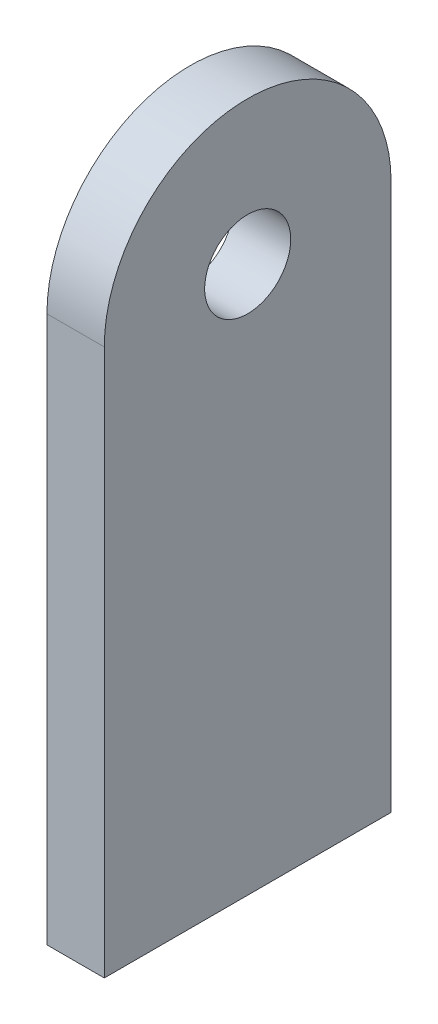
ISO-10303-21;
HEADER;
FILE_DESCRIPTION(('STEP AP214'),'2;1');
FILE_NAME('part.step','',(''),(''),'','','');
FILE_SCHEMA(('AUTOMOTIVE_DESIGN { 1 0 10303 214 1 1 1 1 }'));
ENDSEC;
DATA;
#1=APPLICATION_CONTEXT('core data for automotive mechanical design processes');
#2=APPLICATION_PROTOCOL_DEFINITION('international standard','automotive_design',2000,#1);
#3=PRODUCT_CONTEXT('',#1,'mechanical');
#4=PRODUCT('Part','Part','',(#3));
#5=PRODUCT_RELATED_PRODUCT_CATEGORY('part','',(#4));
#6=PRODUCT_DEFINITION_FORMATION('','',#4);
#7=PRODUCT_DEFINITION_CONTEXT('part definition',#1,'design');
#8=PRODUCT_DEFINITION('design','',#6,#7);
#9=PRODUCT_DEFINITION_SHAPE('','',#8);
#10=(LENGTH_UNIT() NAMED_UNIT(*) SI_UNIT(.MILLI.,.METRE.));
#11=(NAMED_UNIT(*) PLANE_ANGLE_UNIT() SI_UNIT($,.RADIAN.));
#12=(NAMED_UNIT(*) SI_UNIT($,.STERADIAN.) SOLID_ANGLE_UNIT());
#13=UNCERTAINTY_MEASURE_WITH_UNIT(LENGTH_MEASURE(1.E-05),#10,'distance_accuracy_value','');
#14=(GEOMETRIC_REPRESENTATION_CONTEXT(3) GLOBAL_UNCERTAINTY_ASSIGNED_CONTEXT((#13)) GLOBAL_UNIT_ASSIGNED_CONTEXT((#10,
#11,#12)) REPRESENTATION_CONTEXT('',''));
#15=CARTESIAN_POINT('',(0.,0.,0.));
#16=DIRECTION('',(0.,0.,1.));
#17=DIRECTION('',(1.,0.,0.));
#18=AXIS2_PLACEMENT_3D('',#15,#16,#17);
#19=CARTESIAN_POINT('',(10.,50.5673978793407,0.));
#20=DIRECTION('',(1.,0.,0.));
#21=DIRECTION('',(0.,0.,-1.));
#22=AXIS2_PLACEMENT_3D('',#19,#20,#21);
#23=PLANE('',#22);
#24=CARTESIAN_POINT('',(10.,50.5673978793407,0.));
#25=DIRECTION('',(1.,0.,0.));
#26=DIRECTION('',(0.,0.,-1.));
#27=AXIS2_PLACEMENT_3D('',#24,#25,#26);
#28=CIRCLE('',#27,25.);
#29=CARTESIAN_POINT('',(10.,50.5673978793407,-25.));
#30=VERTEX_POINT('',#29);
#31=CARTESIAN_POINT('',(10.,50.5673978793407,25.));
#32=VERTEX_POINT('',#31);
#33=EDGE_CURVE('E84',#30,#32,#28,.T.);
#34=ORIENTED_EDGE('',*,*,#33,.T.);
#35=DIRECTION('',(0.,-1.,0.));
#36=VECTOR('',#35,1.);
#37=CARTESIAN_POINT('',(10.,50.5673978793407,25.));
#38=LINE('',#37,#36);
#39=CARTESIAN_POINT('',(10.,-44.7227033206593,25.));
#40=VERTEX_POINT('',#39);
#41=EDGE_CURVE('E79',#32,#40,#38,.T.);
#42=ORIENTED_EDGE('',*,*,#41,.T.);
#43=DIRECTION('',(0.,0.,-1.));
#44=VECTOR('',#43,1.);
#45=CARTESIAN_POINT('',(10.,-44.7227033206593,25.));
#46=LINE('',#45,#44);
#47=CARTESIAN_POINT('',(10.,-44.7227033206593,-25.));
#48=VERTEX_POINT('',#47);
#49=EDGE_CURVE('E82',#40,#48,#46,.T.);
#50=ORIENTED_EDGE('',*,*,#49,.T.);
#51=DIRECTION('',(0.,1.,0.));
#52=VECTOR('',#51,1.);
#53=CARTESIAN_POINT('',(10.,50.5673978793407,-25.));
#54=LINE('',#53,#52);
#55=EDGE_CURVE('E49',#48,#30,#54,.T.);
#56=ORIENTED_EDGE('',*,*,#55,.T.);
#57=EDGE_LOOP('',(#34,#42,#50,#56));
#58=FACE_BOUND('',#57,.T.);
#59=CARTESIAN_POINT('',(10.,50.5673978793407,0.));
#60=DIRECTION('',(1.,0.,0.));
#61=DIRECTION('',(0.,0.,-1.));
#62=AXIS2_PLACEMENT_3D('',#59,#60,#61);
#63=CIRCLE('',#62,7.5);
#64=CARTESIAN_POINT('',(10.,50.5673978793407,-7.5));
#65=VERTEX_POINT('',#64);
#66=EDGE_CURVE('E99',#65,#65,#63,.T.);
#67=ORIENTED_EDGE('',*,*,#66,.F.);
#68=EDGE_LOOP('',(#67));
#69=FACE_BOUND('',#68,.T.);
#70=ADVANCED_FACE('F32',(#58,#69),#23,.T.);
#71=CARTESIAN_POINT('',(0.,50.5673978793407,0.));
#72=DIRECTION('',(1.,0.,0.));
#73=DIRECTION('',(0.,0.,-1.));
#74=AXIS2_PLACEMENT_3D('',#71,#72,#73);
#75=PLANE('',#74);
#76=CARTESIAN_POINT('',(0.,50.5673978793407,0.));
#77=DIRECTION('',(1.,0.,0.));
#78=DIRECTION('',(0.,0.,-1.));
#79=AXIS2_PLACEMENT_3D('',#76,#77,#78);
#80=CIRCLE('',#79,25.);
#81=CARTESIAN_POINT('',(0.,50.5673978793407,-25.));
#82=VERTEX_POINT('',#81);
#83=CARTESIAN_POINT('',(0.,50.5673978793407,25.));
#84=VERTEX_POINT('',#83);
#85=EDGE_CURVE('E96',#82,#84,#80,.T.);
#86=ORIENTED_EDGE('',*,*,#85,.F.);
#87=DIRECTION('',(0.,1.,0.));
#88=VECTOR('',#87,1.);
#89=CARTESIAN_POINT('',(0.,50.5673978793407,-25.));
#90=LINE('',#89,#88);
#91=CARTESIAN_POINT('',(0.,-44.7227033206593,-25.));
#92=VERTEX_POINT('',#91);
#93=EDGE_CURVE('E72',#92,#82,#90,.T.);
#94=ORIENTED_EDGE('',*,*,#93,.F.);
#95=DIRECTION('',(0.,0.,-1.));
#96=VECTOR('',#95,1.);
#97=CARTESIAN_POINT('',(0.,-44.7227033206593,25.));
#98=LINE('',#97,#96);
#99=CARTESIAN_POINT('',(0.,-44.7227033206593,25.));
#100=VERTEX_POINT('',#99);
#101=EDGE_CURVE('E66',#100,#92,#98,.T.);
#102=ORIENTED_EDGE('',*,*,#101,.F.);
#103=DIRECTION('',(0.,-1.,0.));
#104=VECTOR('',#103,1.);
#105=CARTESIAN_POINT('',(0.,50.5673978793407,25.));
#106=LINE('',#105,#104);
#107=EDGE_CURVE('E88',#84,#100,#106,.T.);
#108=ORIENTED_EDGE('',*,*,#107,.F.);
#109=EDGE_LOOP('',(#86,#94,#102,#108));
#110=FACE_BOUND('',#109,.T.);
#111=CARTESIAN_POINT('',(0.,50.5673978793407,0.));
#112=DIRECTION('',(1.,0.,0.));
#113=DIRECTION('',(0.,0.,-1.));
#114=AXIS2_PLACEMENT_3D('',#111,#112,#113);
#115=CIRCLE('',#114,7.5);
#116=CARTESIAN_POINT('',(0.,50.5673978793407,-7.5));
#117=VERTEX_POINT('',#116);
#118=EDGE_CURVE('E111',#117,#117,#115,.T.);
#119=ORIENTED_EDGE('',*,*,#118,.T.);
#120=EDGE_LOOP('',(#119));
#121=FACE_BOUND('',#120,.T.);
#122=ADVANCED_FACE('F107',(#110,#121),#75,.F.);
#123=CARTESIAN_POINT('',(10.,50.5673978793407,0.));
#124=DIRECTION('',(-1.,0.,0.));
#125=DIRECTION('',(0.,0.,1.));
#126=AXIS2_PLACEMENT_3D('',#123,#124,#125);
#127=CYLINDRICAL_SURFACE('',#126,25.);
#128=ORIENTED_EDGE('',*,*,#85,.T.);
#129=DIRECTION('',(-1.,0.,0.));
#130=VECTOR('',#129,1.);
#131=CARTESIAN_POINT('',(10.,50.5673978793407,25.));
#132=LINE('',#131,#130);
#133=EDGE_CURVE('E11',#32,#84,#132,.T.);
#134=ORIENTED_EDGE('',*,*,#133,.F.);
#135=ORIENTED_EDGE('',*,*,#33,.F.);
#136=DIRECTION('',(-1.,0.,0.));
#137=VECTOR('',#136,1.);
#138=CARTESIAN_POINT('',(10.,50.5673978793407,-25.));
#139=LINE('',#138,#137);
#140=EDGE_CURVE('E92',#30,#82,#139,.T.);
#141=ORIENTED_EDGE('',*,*,#140,.T.);
#142=EDGE_LOOP('',(#128,#134,#135,#141));
#143=FACE_BOUND('',#142,.T.);
#144=ADVANCED_FACE('F34',(#143),#127,.T.);
#145=CARTESIAN_POINT('',(10.,50.5673978793407,25.));
#146=DIRECTION('',(0.,0.,-1.));
#147=DIRECTION('',(-1.,0.,0.));
#148=AXIS2_PLACEMENT_3D('',#145,#146,#147);
#149=PLANE('',#148);
#150=ORIENTED_EDGE('',*,*,#107,.T.);
#151=DIRECTION('',(-1.,0.,0.));
#152=VECTOR('',#151,1.);
#153=CARTESIAN_POINT('',(10.,-44.7227033206593,25.));
#154=LINE('',#153,#152);
#155=EDGE_CURVE('E41',#40,#100,#154,.T.);
#156=ORIENTED_EDGE('',*,*,#155,.F.);
#157=ORIENTED_EDGE('',*,*,#41,.F.);
#158=ORIENTED_EDGE('',*,*,#133,.T.);
#159=EDGE_LOOP('',(#150,#156,#157,#158));
#160=FACE_BOUND('',#159,.T.);
#161=ADVANCED_FACE('F87',(#160),#149,.F.);
#162=CARTESIAN_POINT('',(10.,-44.7227033206593,25.));
#163=DIRECTION('',(0.,1.,0.));
#164=DIRECTION('',(0.,0.,1.));
#165=AXIS2_PLACEMENT_3D('',#162,#163,#164);
#166=PLANE('',#165);
#167=ORIENTED_EDGE('',*,*,#101,.T.);
#168=DIRECTION('',(-1.,0.,0.));
#169=VECTOR('',#168,1.);
#170=CARTESIAN_POINT('',(10.,-44.7227033206593,-25.));
#171=LINE('',#170,#169);
#172=EDGE_CURVE('E89',#48,#92,#171,.T.);
#173=ORIENTED_EDGE('',*,*,#172,.F.);
#174=ORIENTED_EDGE('',*,*,#49,.F.);
#175=ORIENTED_EDGE('',*,*,#155,.T.);
#176=EDGE_LOOP('',(#167,#173,#174,#175));
#177=FACE_BOUND('',#176,.T.);
#178=ADVANCED_FACE('F90',(#177),#166,.F.);
#179=CARTESIAN_POINT('',(10.,50.5673978793407,-25.));
#180=DIRECTION('',(0.,0.,1.));
#181=DIRECTION('',(0.,-1.,0.));
#182=AXIS2_PLACEMENT_3D('',#179,#180,#181);
#183=PLANE('',#182);
#184=ORIENTED_EDGE('',*,*,#93,.T.);
#185=ORIENTED_EDGE('',*,*,#140,.F.);
#186=ORIENTED_EDGE('',*,*,#55,.F.);
#187=ORIENTED_EDGE('',*,*,#172,.T.);
#188=EDGE_LOOP('',(#184,#185,#186,#187));
#189=FACE_BOUND('',#188,.T.);
#190=ADVANCED_FACE('F104',(#189),#183,.F.);
#191=CARTESIAN_POINT('',(10.,50.5673978793407,0.));
#192=DIRECTION('',(-1.,0.,0.));
#193=DIRECTION('',(0.,0.,1.));
#194=AXIS2_PLACEMENT_3D('',#191,#192,#193);
#195=CYLINDRICAL_SURFACE('',#194,7.5);
#196=ORIENTED_EDGE('',*,*,#66,.T.);
#197=EDGE_LOOP('',(#196));
#198=FACE_BOUND('',#197,.T.);
#199=ORIENTED_EDGE('',*,*,#118,.F.);
#200=EDGE_LOOP('',(#199));
#201=FACE_BOUND('',#200,.T.);
#202=ADVANCED_FACE('F117',(#198,#201),#195,.F.);
#203=CLOSED_SHELL('',(#70,#122,#144,#161,#178,#190,#202));
#204=MANIFOLD_SOLID_BREP('B2',#203);
#205=ADVANCED_BREP_SHAPE_REPRESENTATION('',(#18,#204),#14);
#206=SHAPE_DEFINITION_REPRESENTATION(#9,#205);
ENDSEC;
END-ISO-10303-21;
